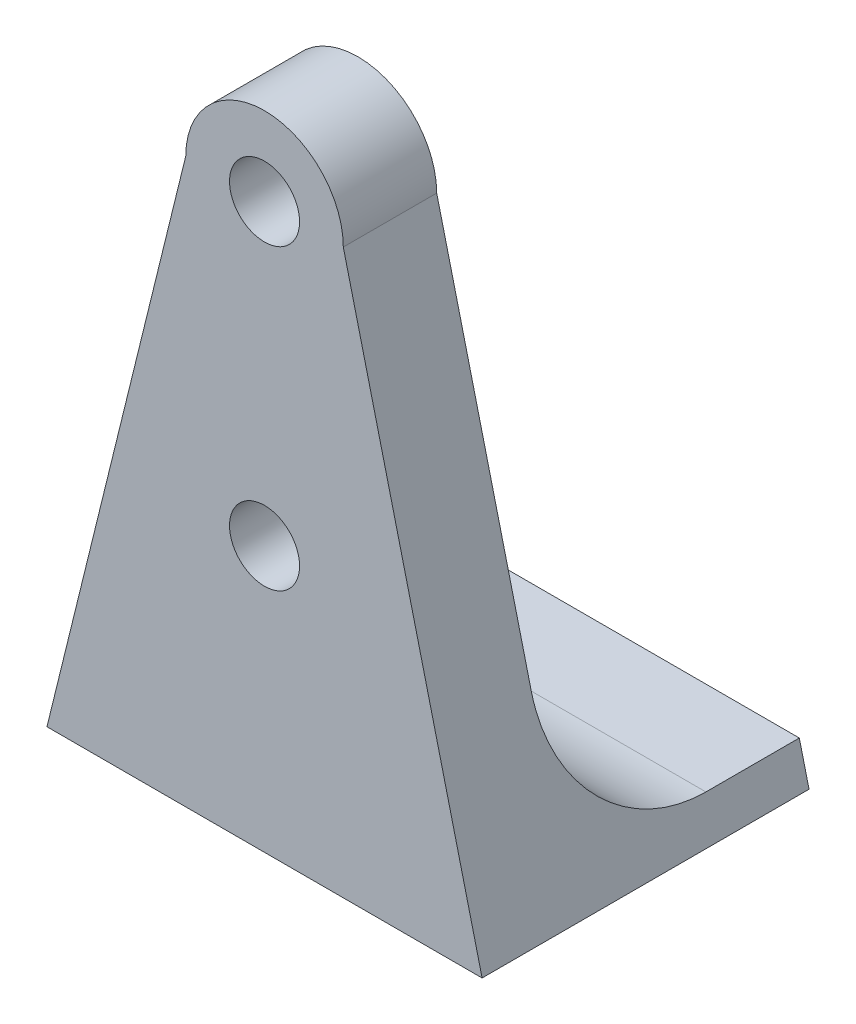
ISO-10303-21;
HEADER;
FILE_DESCRIPTION(('STEP AP214'),'2;1');
FILE_NAME('part.step','',(''),(''),'','','');
FILE_SCHEMA(('AUTOMOTIVE_DESIGN { 1 0 10303 214 1 1 1 1 }'));
ENDSEC;
DATA;
#1=APPLICATION_CONTEXT('core data for automotive mechanical design processes');
#2=APPLICATION_PROTOCOL_DEFINITION('international standard','automotive_design',2000,#1);
#3=PRODUCT_CONTEXT('',#1,'mechanical');
#4=PRODUCT('Part','Part','',(#3));
#5=PRODUCT_RELATED_PRODUCT_CATEGORY('part','',(#4));
#6=PRODUCT_DEFINITION_FORMATION('','',#4);
#7=PRODUCT_DEFINITION_CONTEXT('part definition',#1,'design');
#8=PRODUCT_DEFINITION('design','',#6,#7);
#9=PRODUCT_DEFINITION_SHAPE('','',#8);
#10=(LENGTH_UNIT() NAMED_UNIT(*) SI_UNIT(.MILLI.,.METRE.));
#11=(NAMED_UNIT(*) PLANE_ANGLE_UNIT() SI_UNIT($,.RADIAN.));
#12=(NAMED_UNIT(*) SI_UNIT($,.STERADIAN.) SOLID_ANGLE_UNIT());
#13=UNCERTAINTY_MEASURE_WITH_UNIT(LENGTH_MEASURE(1.E-05),#10,'distance_accuracy_value','');
#14=(GEOMETRIC_REPRESENTATION_CONTEXT(3) GLOBAL_UNCERTAINTY_ASSIGNED_CONTEXT((#13)) GLOBAL_UNIT_ASSIGNED_CONTEXT((#10,
#11,#12)) REPRESENTATION_CONTEXT('',''));
#15=CARTESIAN_POINT('',(0.,0.,0.));
#16=DIRECTION('',(0.,0.,1.));
#17=DIRECTION('',(1.,0.,0.));
#18=AXIS2_PLACEMENT_3D('',#15,#16,#17);
#19=CARTESIAN_POINT('',(0.,8.50595343477778,0.));
#20=DIRECTION('',(0.,0.,1.));
#21=DIRECTION('',(1.,0.,0.));
#22=AXIS2_PLACEMENT_3D('',#19,#20,#21);
#23=PLANE('',#22);
#24=CARTESIAN_POINT('',(0.,8.50595343477778,0.));
#25=DIRECTION('',(0.,0.,1.));
#26=DIRECTION('',(1.,0.,0.));
#27=AXIS2_PLACEMENT_3D('',#24,#25,#26);
#28=CIRCLE('',#27,0.749999999999999);
#29=CARTESIAN_POINT('',(0.749999999999999,8.50595343477778,0.));
#30=VERTEX_POINT('',#29);
#31=EDGE_CURVE('E38',#30,#30,#28,.T.);
#32=ORIENTED_EDGE('',*,*,#31,.T.);
#33=EDGE_LOOP('',(#32));
#34=FACE_BOUND('',#33,.T.);
#35=CARTESIAN_POINT('',(0.,2.1234650874149,0.));
#36=DIRECTION('',(0.,0.,1.));
#37=DIRECTION('',(1.,0.,0.));
#38=AXIS2_PLACEMENT_3D('',#35,#36,#37);
#39=CIRCLE('',#38,0.749999999999999);
#40=CARTESIAN_POINT('',(0.749999999999999,2.1234650874149,0.));
#41=VERTEX_POINT('',#40);
#42=EDGE_CURVE('E119',#41,#41,#39,.T.);
#43=ORIENTED_EDGE('',*,*,#42,.T.);
#44=EDGE_LOOP('',(#43));
#45=FACE_BOUND('',#44,.T.);
#46=DIRECTION('',(-0.23915393068933,0.97098166688967,0.));
#47=VECTOR('',#46,1.);
#48=CARTESIAN_POINT('',(1.68643771804766,8.50595343477778,0.));
#49=LINE('',#48,#47);
#50=CARTESIAN_POINT('',(3.71124611505874,0.285089881353714,0.));
#51=VERTEX_POINT('',#50);
#52=CARTESIAN_POINT('',(1.68643771804766,8.50595343477778,0.));
#53=VERTEX_POINT('',#52);
#54=EDGE_CURVE('E133',#51,#53,#49,.T.);
#55=ORIENTED_EDGE('',*,*,#54,.F.);
#56=DIRECTION('',(1.,0.,0.));
#57=VECTOR('',#56,1.);
#58=CARTESIAN_POINT('',(-4.45014965622056,0.285089881353714,0.));
#59=LINE('',#58,#57);
#60=CARTESIAN_POINT('',(-3.71124611505874,0.285089881353714,0.));
#61=VERTEX_POINT('',#60);
#62=EDGE_CURVE('E57',#51,#61,#59,.F.);
#63=ORIENTED_EDGE('',*,*,#62,.T.);
#64=DIRECTION('',(-0.23915393068933,-0.97098166688967,0.));
#65=VECTOR('',#64,1.);
#66=CARTESIAN_POINT('',(-1.68643771804766,8.50595343477778,0.));
#67=LINE('',#66,#65);
#68=CARTESIAN_POINT('',(-1.68643771804766,8.50595343477778,0.));
#69=VERTEX_POINT('',#68);
#70=EDGE_CURVE('E136',#69,#61,#67,.T.);
#71=ORIENTED_EDGE('',*,*,#70,.F.);
#72=CARTESIAN_POINT('',(0.,8.50595343477778,0.));
#73=DIRECTION('',(0.,0.,1.));
#74=DIRECTION('',(1.,0.,0.));
#75=AXIS2_PLACEMENT_3D('',#72,#73,#74);
#76=CIRCLE('',#75,1.68643771804766);
#77=EDGE_CURVE('E142',#53,#69,#76,.T.);
#78=ORIENTED_EDGE('',*,*,#77,.F.);
#79=EDGE_LOOP('',(#55,#63,#71,#78));
#80=FACE_BOUND('',#79,.T.);
#81=ADVANCED_FACE('F34',(#34,#45,#80),#23,.F.);
#82=CARTESIAN_POINT('',(1.68643771804768,8.50595343477778,1.99999999999997));
#83=DIRECTION('',(-0.970981666889671,-0.23915393068933,0.));
#84=DIRECTION('',(0.23915393068933,-0.970981666889671,0.));
#85=AXIS2_PLACEMENT_3D('',#82,#83,#84);
#86=PLANE('',#85);
#87=DIRECTION('',(0.,0.,-1.));
#88=VECTOR('',#87,1.);
#89=CARTESIAN_POINT('',(4.65853658536587,-3.5609756097561,2.));
#90=LINE('',#89,#88);
#91=CARTESIAN_POINT('',(4.65853658536587,-3.5609756097561,2.));
#92=VERTEX_POINT('',#91);
#93=CARTESIAN_POINT('',(4.65853658536591,-3.5609756097561,-5.));
#94=VERTEX_POINT('',#93);
#95=EDGE_CURVE('E94',#92,#94,#90,.T.);
#96=ORIENTED_EDGE('',*,*,#95,.T.);
#97=DIRECTION('',(0.239153930689331,-0.97098166688967,0.));
#98=VECTOR('',#97,1.);
#99=CARTESIAN_POINT('',(4.45014965622063,-2.71491011864629,-5.00000000000003));
#100=LINE('',#99,#98);
#101=CARTESIAN_POINT('',(4.45014965622063,-2.71491011864629,-5.00000000000003));
#102=VERTEX_POINT('',#101);
#103=EDGE_CURVE('E98',#102,#94,#100,.T.);
#104=ORIENTED_EDGE('',*,*,#103,.F.);
#105=DIRECTION('',(0.,0.,1.));
#106=VECTOR('',#105,1.);
#107=CARTESIAN_POINT('',(4.45014965622063,-2.71491011864629,-5.00000000000003));
#108=LINE('',#107,#106);
#109=CARTESIAN_POINT('',(4.45014965622056,-2.71491011864629,-3.00000000000003));
#110=VERTEX_POINT('',#109);
#111=EDGE_CURVE('E128',#102,#110,#108,.T.);
#112=ORIENTED_EDGE('',*,*,#111,.T.);
#113=CARTESIAN_POINT('',(3.71124611505874,0.285089881353714,-3.00000000000003));
#114=DIRECTION('',(-0.970981666889671,-0.23915393068933,0.));
#115=DIRECTION('',(-0.23915393068933,0.970981666889671,0.));
#116=AXIS2_PLACEMENT_3D('',#113,#114,#115);
#117=ELLIPSE('',#116,3.08965668693813,3.);
#118=EDGE_CURVE('E43',#110,#51,#117,.T.);
#119=ORIENTED_EDGE('',*,*,#118,.T.);
#120=ORIENTED_EDGE('',*,*,#54,.T.);
#121=DIRECTION('',(0.,0.,-1.));
#122=VECTOR('',#121,1.);
#123=CARTESIAN_POINT('',(1.68643771804768,8.50595343477778,1.99999999999997));
#124=LINE('',#123,#122);
#125=CARTESIAN_POINT('',(1.68643771804768,8.50595343477778,1.99999999999997));
#126=VERTEX_POINT('',#125);
#127=EDGE_CURVE('E149',#126,#53,#124,.T.);
#128=ORIENTED_EDGE('',*,*,#127,.F.);
#129=DIRECTION('',(-0.23915393068933,0.97098166688967,0.));
#130=VECTOR('',#129,1.);
#131=CARTESIAN_POINT('',(1.68643771804768,8.50595343477778,1.99999999999997));
#132=LINE('',#131,#130);
#133=EDGE_CURVE('E101',#92,#126,#132,.T.);
#134=ORIENTED_EDGE('',*,*,#133,.F.);
#135=EDGE_LOOP('',(#96,#104,#112,#119,#120,#128,#134));
#136=FACE_BOUND('',#135,.T.);
#137=ADVANCED_FACE('F96',(#136),#86,.F.);
#138=CARTESIAN_POINT('',(0.,8.50595343477778,1.99999999999999));
#139=DIRECTION('',(0.,0.,-1.));
#140=DIRECTION('',(-1.,0.,0.));
#141=AXIS2_PLACEMENT_3D('',#138,#139,#140);
#142=CYLINDRICAL_SURFACE('',#141,1.68643771804766);
#143=ORIENTED_EDGE('',*,*,#77,.T.);
#144=DIRECTION('',(0.,0.,-1.));
#145=VECTOR('',#144,1.);
#146=CARTESIAN_POINT('',(-1.68643771804765,8.50595343477778,1.99999999999999));
#147=LINE('',#146,#145);
#148=CARTESIAN_POINT('',(-1.68643771804765,8.50595343477778,1.99999999999999));
#149=VERTEX_POINT('',#148);
#150=EDGE_CURVE('E146',#149,#69,#147,.T.);
#151=ORIENTED_EDGE('',*,*,#150,.F.);
#152=CARTESIAN_POINT('',(0.,8.50595343477778,1.99999999999999));
#153=DIRECTION('',(0.,0.,1.));
#154=DIRECTION('',(1.,0.,0.));
#155=AXIS2_PLACEMENT_3D('',#152,#153,#154);
#156=CIRCLE('',#155,1.68643771804766);
#157=EDGE_CURVE('E135',#126,#149,#156,.T.);
#158=ORIENTED_EDGE('',*,*,#157,.F.);
#159=ORIENTED_EDGE('',*,*,#127,.T.);
#160=EDGE_LOOP('',(#143,#151,#158,#159));
#161=FACE_BOUND('',#160,.T.);
#162=ADVANCED_FACE('F168',(#161),#142,.T.);
#163=CARTESIAN_POINT('',(-1.68643771804765,8.50595343477778,1.99999999999999));
#164=DIRECTION('',(0.970981666889671,-0.23915393068933,0.));
#165=DIRECTION('',(0.23915393068933,0.970981666889671,0.));
#166=AXIS2_PLACEMENT_3D('',#163,#164,#165);
#167=PLANE('',#166);
#168=ORIENTED_EDGE('',*,*,#70,.T.);
#169=CARTESIAN_POINT('',(-3.71124611505874,0.285089881353714,-3.));
#170=DIRECTION('',(0.970981666889671,-0.23915393068933,0.));
#171=DIRECTION('',(-0.23915393068933,-0.970981666889671,0.));
#172=AXIS2_PLACEMENT_3D('',#169,#170,#171);
#173=ELLIPSE('',#172,3.08965668693813,3.);
#174=CARTESIAN_POINT('',(-4.45014965622056,-2.71491011864629,-3.));
#175=VERTEX_POINT('',#174);
#176=EDGE_CURVE('E11',#61,#175,#173,.T.);
#177=ORIENTED_EDGE('',*,*,#176,.T.);
#178=DIRECTION('',(0.,0.,1.));
#179=VECTOR('',#178,1.);
#180=CARTESIAN_POINT('',(-4.4501496562205,-2.71491011864629,-5.));
#181=LINE('',#180,#179);
#182=CARTESIAN_POINT('',(-4.4501496562205,-2.71491011864629,-5.));
#183=VERTEX_POINT('',#182);
#184=EDGE_CURVE('E130',#183,#175,#181,.T.);
#185=ORIENTED_EDGE('',*,*,#184,.F.);
#186=DIRECTION('',(0.23915393068933,0.97098166688967,0.));
#187=VECTOR('',#186,1.);
#188=CARTESIAN_POINT('',(-4.4501496562205,-2.71491011864629,-5.));
#189=LINE('',#188,#187);
#190=CARTESIAN_POINT('',(-4.65853658536579,-3.5609756097561,-5.));
#191=VERTEX_POINT('',#190);
#192=EDGE_CURVE('E113',#191,#183,#189,.T.);
#193=ORIENTED_EDGE('',*,*,#192,.F.);
#194=DIRECTION('',(0.,0.,-1.));
#195=VECTOR('',#194,1.);
#196=CARTESIAN_POINT('',(-4.65853658536584,-3.5609756097561,2.));
#197=LINE('',#196,#195);
#198=CARTESIAN_POINT('',(-4.65853658536584,-3.5609756097561,2.));
#199=VERTEX_POINT('',#198);
#200=EDGE_CURVE('E104',#199,#191,#197,.T.);
#201=ORIENTED_EDGE('',*,*,#200,.F.);
#202=DIRECTION('',(-0.23915393068933,-0.97098166688967,0.));
#203=VECTOR('',#202,1.);
#204=CARTESIAN_POINT('',(-1.68643771804765,8.50595343477778,1.99999999999999));
#205=LINE('',#204,#203);
#206=EDGE_CURVE('E138',#149,#199,#205,.T.);
#207=ORIENTED_EDGE('',*,*,#206,.F.);
#208=ORIENTED_EDGE('',*,*,#150,.T.);
#209=EDGE_LOOP('',(#168,#177,#185,#193,#201,#207,#208));
#210=FACE_BOUND('',#209,.T.);
#211=ADVANCED_FACE('F163',(#210),#167,.F.);
#212=CARTESIAN_POINT('',(-4.65853658536584,-3.5609756097561,2.));
#213=DIRECTION('',(0.,1.,0.));
#214=DIRECTION('',(0.,0.,1.));
#215=AXIS2_PLACEMENT_3D('',#212,#213,#214);
#216=PLANE('',#215);
#217=ORIENTED_EDGE('',*,*,#200,.T.);
#218=DIRECTION('',(-1.,0.,0.));
#219=VECTOR('',#218,1.);
#220=CARTESIAN_POINT('',(4.65853658536591,-3.5609756097561,-5.));
#221=LINE('',#220,#219);
#222=EDGE_CURVE('E108',#94,#191,#221,.T.);
#223=ORIENTED_EDGE('',*,*,#222,.F.);
#224=ORIENTED_EDGE('',*,*,#95,.F.);
#225=DIRECTION('',(1.,0.,0.));
#226=VECTOR('',#225,1.);
#227=CARTESIAN_POINT('',(-4.65853658536584,-3.5609756097561,2.));
#228=LINE('',#227,#226);
#229=EDGE_CURVE('E105',#199,#92,#228,.T.);
#230=ORIENTED_EDGE('',*,*,#229,.F.);
#231=EDGE_LOOP('',(#217,#223,#224,#230));
#232=FACE_BOUND('',#231,.T.);
#233=ADVANCED_FACE('F109',(#232),#216,.F.);
#234=CARTESIAN_POINT('',(0.,8.50595343477778,1.99999999999999));
#235=DIRECTION('',(0.,0.,1.));
#236=DIRECTION('',(1.,0.,0.));
#237=AXIS2_PLACEMENT_3D('',#234,#235,#236);
#238=PLANE('',#237);
#239=CARTESIAN_POINT('',(0.,8.50595343477778,1.99999999999999));
#240=DIRECTION('',(0.,0.,1.));
#241=DIRECTION('',(1.,0.,0.));
#242=AXIS2_PLACEMENT_3D('',#239,#240,#241);
#243=CIRCLE('',#242,0.749999999999999);
#244=CARTESIAN_POINT('',(0.750000000000069,8.50595343477778,1.99999999999999));
#245=VERTEX_POINT('',#244);
#246=EDGE_CURVE('E246',#245,#245,#243,.T.);
#247=ORIENTED_EDGE('',*,*,#246,.F.);
#248=EDGE_LOOP('',(#247));
#249=FACE_BOUND('',#248,.T.);
#250=CARTESIAN_POINT('',(0.,2.1234650874149,1.99999999999999));
#251=DIRECTION('',(0.,0.,1.));
#252=DIRECTION('',(1.,0.,0.));
#253=AXIS2_PLACEMENT_3D('',#250,#251,#252);
#254=CIRCLE('',#253,0.749999999999999);
#255=CARTESIAN_POINT('',(0.750000000000069,2.1234650874149,1.99999999999999));
#256=VERTEX_POINT('',#255);
#257=EDGE_CURVE('E122',#256,#256,#254,.T.);
#258=ORIENTED_EDGE('',*,*,#257,.F.);
#259=EDGE_LOOP('',(#258));
#260=FACE_BOUND('',#259,.T.);
#261=ORIENTED_EDGE('',*,*,#133,.T.);
#262=ORIENTED_EDGE('',*,*,#157,.T.);
#263=ORIENTED_EDGE('',*,*,#206,.T.);
#264=ORIENTED_EDGE('',*,*,#229,.T.);
#265=EDGE_LOOP('',(#261,#262,#263,#264));
#266=FACE_BOUND('',#265,.T.);
#267=ADVANCED_FACE('F170',(#249,#260,#266),#238,.T.);
#268=CARTESIAN_POINT('',(4.45014965622063,-2.71491011864629,-5.00000000000003));
#269=DIRECTION('',(0.,-1.,0.));
#270=DIRECTION('',(1.,0.,0.));
#271=AXIS2_PLACEMENT_3D('',#268,#269,#270);
#272=PLANE('',#271);
#273=ORIENTED_EDGE('',*,*,#184,.T.);
#274=DIRECTION('',(1.,0.,0.));
#275=VECTOR('',#274,1.);
#276=CARTESIAN_POINT('',(4.45014965622056,-2.71491011864629,-3.00000000000003));
#277=LINE('',#276,#275);
#278=EDGE_CURVE('E152',#175,#110,#277,.T.);
#279=ORIENTED_EDGE('',*,*,#278,.T.);
#280=ORIENTED_EDGE('',*,*,#111,.F.);
#281=DIRECTION('',(1.,0.,0.));
#282=VECTOR('',#281,1.);
#283=CARTESIAN_POINT('',(4.45014965622063,-2.71491011864629,-5.00000000000003));
#284=LINE('',#283,#282);
#285=EDGE_CURVE('E117',#183,#102,#284,.T.);
#286=ORIENTED_EDGE('',*,*,#285,.F.);
#287=EDGE_LOOP('',(#273,#279,#280,#286));
#288=FACE_BOUND('',#287,.T.);
#289=ADVANCED_FACE('F158',(#288),#272,.F.);
#290=CARTESIAN_POINT('',(0.,0.,-5.));
#291=DIRECTION('',(0.,0.,-1.));
#292=DIRECTION('',(-1.,0.,0.));
#293=AXIS2_PLACEMENT_3D('',#290,#291,#292);
#294=PLANE('',#293);
#295=ORIENTED_EDGE('',*,*,#103,.T.);
#296=ORIENTED_EDGE('',*,*,#222,.T.);
#297=ORIENTED_EDGE('',*,*,#192,.T.);
#298=ORIENTED_EDGE('',*,*,#285,.T.);
#299=EDGE_LOOP('',(#295,#296,#297,#298));
#300=FACE_BOUND('',#299,.T.);
#301=ADVANCED_FACE('F115',(#300),#294,.T.);
#302=CARTESIAN_POINT('',(4.45014965622056,0.285089881353714,-3.00000000000003));
#303=DIRECTION('',(-1.,0.,0.));
#304=DIRECTION('',(0.,-1.,0.));
#305=AXIS2_PLACEMENT_3D('',#302,#303,#304);
#306=CYLINDRICAL_SURFACE('',#305,3.);
#307=ORIENTED_EDGE('',*,*,#176,.F.);
#308=ORIENTED_EDGE('',*,*,#62,.F.);
#309=ORIENTED_EDGE('',*,*,#118,.F.);
#310=ORIENTED_EDGE('',*,*,#278,.F.);
#311=EDGE_LOOP('',(#307,#308,#309,#310));
#312=FACE_BOUND('',#311,.T.);
#313=ADVANCED_FACE('F36',(#312),#306,.F.);
#314=CARTESIAN_POINT('',(0.,2.1234650874149,1.99999999999999));
#315=DIRECTION('',(0.,0.,1.));
#316=DIRECTION('',(1.,0.,0.));
#317=AXIS2_PLACEMENT_3D('',#314,#315,#316);
#318=CYLINDRICAL_SURFACE('',#317,0.749999999999999);
#319=ORIENTED_EDGE('',*,*,#257,.T.);
#320=EDGE_LOOP('',(#319));
#321=FACE_BOUND('',#320,.T.);
#322=ORIENTED_EDGE('',*,*,#42,.F.);
#323=EDGE_LOOP('',(#322));
#324=FACE_BOUND('',#323,.T.);
#325=ADVANCED_FACE('F228',(#321,#324),#318,.F.);
#326=CARTESIAN_POINT('',(0.,8.50595343477778,1.99999999999999));
#327=DIRECTION('',(0.,0.,1.));
#328=DIRECTION('',(1.,0.,0.));
#329=AXIS2_PLACEMENT_3D('',#326,#327,#328);
#330=CYLINDRICAL_SURFACE('',#329,0.749999999999999);
#331=ORIENTED_EDGE('',*,*,#246,.T.);
#332=EDGE_LOOP('',(#331));
#333=FACE_BOUND('',#332,.T.);
#334=ORIENTED_EDGE('',*,*,#31,.F.);
#335=EDGE_LOOP('',(#334));
#336=FACE_BOUND('',#335,.T.);
#337=ADVANCED_FACE('F234',(#333,#336),#330,.F.);
#338=CLOSED_SHELL('',(#81,#137,#162,#211,#233,#267,#289,#301,#313,#325,#337));
#339=MANIFOLD_SOLID_BREP('B2',#338);
#340=ADVANCED_BREP_SHAPE_REPRESENTATION('',(#18,#339),#14);
#341=SHAPE_DEFINITION_REPRESENTATION(#9,#340);
ENDSEC;
END-ISO-10303-21;
